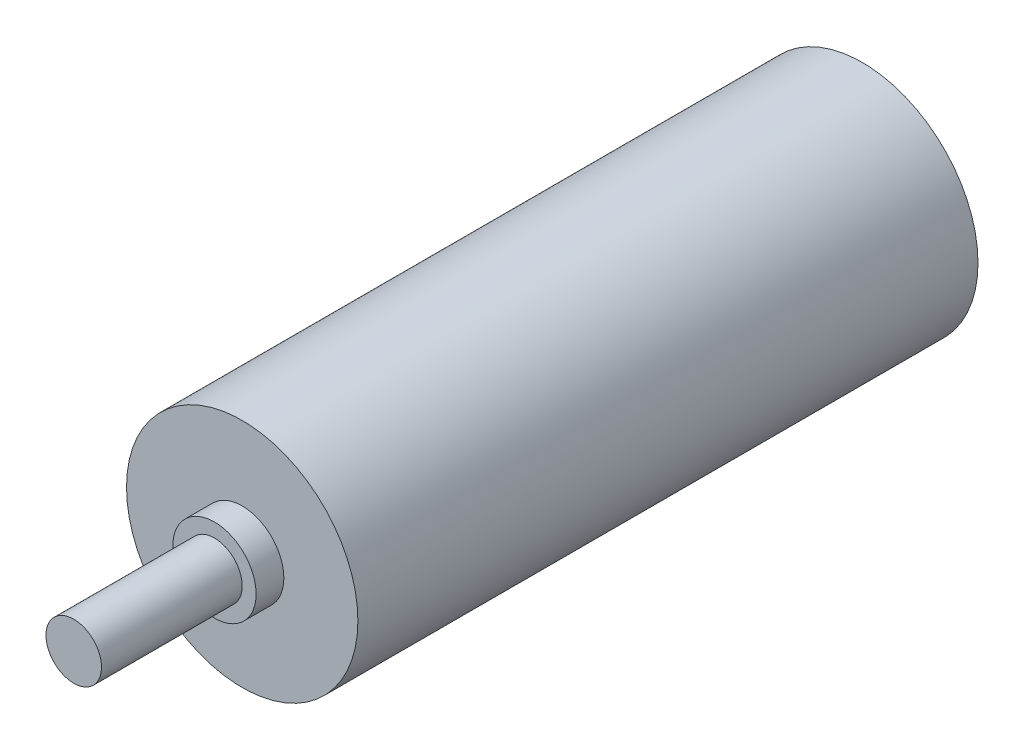
ISO-10303-21;
HEADER;
FILE_DESCRIPTION(('STEP AP214'),'2;1');
FILE_NAME('part.step','',(''),(''),'','','');
FILE_SCHEMA(('AUTOMOTIVE_DESIGN { 1 0 10303 214 1 1 1 1 }'));
ENDSEC;
DATA;
#1=APPLICATION_CONTEXT('core data for automotive mechanical design processes');
#2=APPLICATION_PROTOCOL_DEFINITION('international standard','automotive_design',2000,#1);
#3=PRODUCT_CONTEXT('',#1,'mechanical');
#4=PRODUCT('Part','Part','',(#3));
#5=PRODUCT_RELATED_PRODUCT_CATEGORY('part','',(#4));
#6=PRODUCT_DEFINITION_FORMATION('','',#4);
#7=PRODUCT_DEFINITION_CONTEXT('part definition',#1,'design');
#8=PRODUCT_DEFINITION('design','',#6,#7);
#9=PRODUCT_DEFINITION_SHAPE('','',#8);
#10=(LENGTH_UNIT() NAMED_UNIT(*) SI_UNIT(.MILLI.,.METRE.));
#11=(NAMED_UNIT(*) PLANE_ANGLE_UNIT() SI_UNIT($,.RADIAN.));
#12=(NAMED_UNIT(*) SI_UNIT($,.STERADIAN.) SOLID_ANGLE_UNIT());
#13=UNCERTAINTY_MEASURE_WITH_UNIT(LENGTH_MEASURE(1.E-05),#10,'distance_accuracy_value','');
#14=(GEOMETRIC_REPRESENTATION_CONTEXT(3) GLOBAL_UNCERTAINTY_ASSIGNED_CONTEXT((#13)) GLOBAL_UNIT_ASSIGNED_CONTEXT((#10,
#11,#12)) REPRESENTATION_CONTEXT('',''));
#15=CARTESIAN_POINT('',(0.,0.,0.));
#16=DIRECTION('',(0.,0.,1.));
#17=DIRECTION('',(1.,0.,0.));
#18=AXIS2_PLACEMENT_3D('',#15,#16,#17);
#19=CARTESIAN_POINT('',(0.,0.,67.));
#20=DIRECTION('',(0.,0.,-1.));
#21=DIRECTION('',(-1.,0.,0.));
#22=AXIS2_PLACEMENT_3D('',#19,#20,#21);
#23=CYLINDRICAL_SURFACE('',#22,12.5);
#24=CARTESIAN_POINT('',(0.,0.,67.));
#25=DIRECTION('',(0.,0.,1.));
#26=DIRECTION('',(1.,0.,0.));
#27=AXIS2_PLACEMENT_3D('',#24,#25,#26);
#28=CIRCLE('',#27,12.5);
#29=CARTESIAN_POINT('',(12.5,0.,67.));
#30=VERTEX_POINT('',#29);
#31=EDGE_CURVE('E44',#30,#30,#28,.T.);
#32=ORIENTED_EDGE('',*,*,#31,.F.);
#33=EDGE_LOOP('',(#32));
#34=FACE_BOUND('',#33,.T.);
#35=CARTESIAN_POINT('',(0.,0.,0.));
#36=DIRECTION('',(0.,0.,1.));
#37=DIRECTION('',(1.,0.,0.));
#38=AXIS2_PLACEMENT_3D('',#35,#36,#37);
#39=CIRCLE('',#38,12.5);
#40=CARTESIAN_POINT('',(12.5,0.,0.));
#41=VERTEX_POINT('',#40);
#42=EDGE_CURVE('E35',#41,#41,#39,.T.);
#43=ORIENTED_EDGE('',*,*,#42,.T.);
#44=EDGE_LOOP('',(#43));
#45=FACE_BOUND('',#44,.T.);
#46=ADVANCED_FACE('F32',(#34,#45),#23,.T.);
#47=CARTESIAN_POINT('',(0.,0.,67.));
#48=DIRECTION('',(0.,0.,1.));
#49=DIRECTION('',(1.,0.,0.));
#50=AXIS2_PLACEMENT_3D('',#47,#48,#49);
#51=PLANE('',#50);
#52=CARTESIAN_POINT('',(0.,0.,67.));
#53=DIRECTION('',(0.,0.,1.));
#54=DIRECTION('',(1.,0.,0.));
#55=AXIS2_PLACEMENT_3D('',#52,#53,#54);
#56=CIRCLE('',#55,4.5);
#57=CARTESIAN_POINT('',(4.5,0.,67.));
#58=VERTEX_POINT('',#57);
#59=EDGE_CURVE('E39',#58,#58,#56,.T.);
#60=ORIENTED_EDGE('',*,*,#59,.F.);
#61=EDGE_LOOP('',(#60));
#62=FACE_BOUND('',#61,.T.);
#63=ORIENTED_EDGE('',*,*,#31,.T.);
#64=EDGE_LOOP('',(#63));
#65=FACE_BOUND('',#64,.T.);
#66=ADVANCED_FACE('F61',(#62,#65),#51,.T.);
#67=CARTESIAN_POINT('',(0.,0.,0.));
#68=DIRECTION('',(0.,0.,1.));
#69=DIRECTION('',(1.,0.,0.));
#70=AXIS2_PLACEMENT_3D('',#67,#68,#69);
#71=PLANE('',#70);
#72=ORIENTED_EDGE('',*,*,#42,.F.);
#73=EDGE_LOOP('',(#72));
#74=FACE_BOUND('',#73,.T.);
#75=ADVANCED_FACE('F58',(#74),#71,.F.);
#76=CARTESIAN_POINT('',(0.,0.,70.));
#77=DIRECTION('',(0.,0.,-1.));
#78=DIRECTION('',(-1.,0.,0.));
#79=AXIS2_PLACEMENT_3D('',#76,#77,#78);
#80=CYLINDRICAL_SURFACE('',#79,4.5);
#81=CARTESIAN_POINT('',(0.,0.,70.));
#82=DIRECTION('',(0.,0.,1.));
#83=DIRECTION('',(1.,0.,0.));
#84=AXIS2_PLACEMENT_3D('',#81,#82,#83);
#85=CIRCLE('',#84,4.5);
#86=CARTESIAN_POINT('',(4.5,0.,70.));
#87=VERTEX_POINT('',#86);
#88=EDGE_CURVE('E49',#87,#87,#85,.T.);
#89=ORIENTED_EDGE('',*,*,#88,.F.);
#90=EDGE_LOOP('',(#89));
#91=FACE_BOUND('',#90,.T.);
#92=ORIENTED_EDGE('',*,*,#59,.T.);
#93=EDGE_LOOP('',(#92));
#94=FACE_BOUND('',#93,.T.);
#95=ADVANCED_FACE('F60',(#91,#94),#80,.T.);
#96=CARTESIAN_POINT('',(0.,0.,70.));
#97=DIRECTION('',(0.,0.,1.));
#98=DIRECTION('',(1.,0.,0.));
#99=AXIS2_PLACEMENT_3D('',#96,#97,#98);
#100=PLANE('',#99);
#101=CARTESIAN_POINT('',(0.,0.,70.));
#102=DIRECTION('',(0.,0.,1.));
#103=DIRECTION('',(1.,0.,0.));
#104=AXIS2_PLACEMENT_3D('',#101,#102,#103);
#105=CIRCLE('',#104,3.);
#106=CARTESIAN_POINT('',(-3.,0.,70.));
#107=VERTEX_POINT('',#106);
#108=EDGE_CURVE('E10',#107,#107,#105,.T.);
#109=ORIENTED_EDGE('',*,*,#108,.F.);
#110=EDGE_LOOP('',(#109));
#111=FACE_BOUND('',#110,.T.);
#112=ORIENTED_EDGE('',*,*,#88,.T.);
#113=EDGE_LOOP('',(#112));
#114=FACE_BOUND('',#113,.T.);
#115=ADVANCED_FACE('F66',(#111,#114),#100,.T.);
#116=CARTESIAN_POINT('',(0.,0.,85.2));
#117=DIRECTION('',(0.,0.,-1.));
#118=DIRECTION('',(-1.,0.,0.));
#119=AXIS2_PLACEMENT_3D('',#116,#117,#118);
#120=CYLINDRICAL_SURFACE('',#119,3.);
#121=CARTESIAN_POINT('',(0.,0.,85.2));
#122=DIRECTION('',(0.,0.,1.));
#123=DIRECTION('',(1.,0.,0.));
#124=AXIS2_PLACEMENT_3D('',#121,#122,#123);
#125=CIRCLE('',#124,3.);
#126=CARTESIAN_POINT('',(-3.,0.,85.2));
#127=VERTEX_POINT('',#126);
#128=EDGE_CURVE('E48',#127,#127,#125,.T.);
#129=CARTESIAN_POINT('',(-3.,0.,85.2));
#130=CARTESIAN_POINT('',(-3.,0.,85.0416666666667));
#131=CARTESIAN_POINT('',(-3.,0.,84.8833333333333));
#132=CARTESIAN_POINT('',(-3.,0.,84.5666666666667));
#133=CARTESIAN_POINT('',(-3.,0.,84.4083333333333));
#134=CARTESIAN_POINT('',(-3.,0.,84.0916666666667));
#135=CARTESIAN_POINT('',(-3.,0.,83.9333333333333));
#136=CARTESIAN_POINT('',(-3.,0.,83.6166666666667));
#137=CARTESIAN_POINT('',(-3.,0.,83.4583333333333));
#138=CARTESIAN_POINT('',(-3.,0.,83.1416666666667));
#139=CARTESIAN_POINT('',(-3.,0.,82.9833333333333));
#140=CARTESIAN_POINT('',(-3.,0.,82.6666666666667));
#141=CARTESIAN_POINT('',(-3.,0.,82.5083333333333));
#142=CARTESIAN_POINT('',(-3.,0.,82.1916666666667));
#143=CARTESIAN_POINT('',(-3.,0.,82.0333333333333));
#144=CARTESIAN_POINT('',(-3.,0.,81.7166666666667));
#145=CARTESIAN_POINT('',(-3.,0.,81.5583333333333));
#146=CARTESIAN_POINT('',(-3.,0.,81.2416666666667));
#147=CARTESIAN_POINT('',(-3.,0.,81.0833333333333));
#148=CARTESIAN_POINT('',(-3.,0.,80.7666666666667));
#149=CARTESIAN_POINT('',(-3.,0.,80.6083333333333));
#150=CARTESIAN_POINT('',(-3.,0.,80.2916666666667));
#151=CARTESIAN_POINT('',(-3.,0.,80.1333333333333));
#152=CARTESIAN_POINT('',(-3.,0.,79.8166666666667));
#153=CARTESIAN_POINT('',(-3.,0.,79.6583333333333));
#154=CARTESIAN_POINT('',(-3.,0.,79.3416666666667));
#155=CARTESIAN_POINT('',(-3.,0.,79.1833333333333));
#156=CARTESIAN_POINT('',(-3.,0.,78.8666666666667));
#157=CARTESIAN_POINT('',(-3.,0.,78.7083333333333));
#158=CARTESIAN_POINT('',(-3.,0.,78.3916666666667));
#159=CARTESIAN_POINT('',(-3.,0.,78.2333333333333));
#160=CARTESIAN_POINT('',(-3.,0.,77.9166666666667));
#161=CARTESIAN_POINT('',(-3.,0.,77.7583333333333));
#162=CARTESIAN_POINT('',(-3.,0.,77.4416666666667));
#163=CARTESIAN_POINT('',(-3.,0.,77.2833333333333));
#164=CARTESIAN_POINT('',(-3.,0.,76.9666666666667));
#165=CARTESIAN_POINT('',(-3.,0.,76.8083333333333));
#166=CARTESIAN_POINT('',(-3.,0.,76.4916666666667));
#167=CARTESIAN_POINT('',(-3.,0.,76.3333333333333));
#168=CARTESIAN_POINT('',(-3.,0.,76.0166666666667));
#169=CARTESIAN_POINT('',(-3.,0.,75.8583333333333));
#170=CARTESIAN_POINT('',(-3.,0.,75.5416666666667));
#171=CARTESIAN_POINT('',(-3.,0.,75.3833333333333));
#172=CARTESIAN_POINT('',(-3.,0.,75.0666666666667));
#173=CARTESIAN_POINT('',(-3.,0.,74.9083333333333));
#174=CARTESIAN_POINT('',(-3.,0.,74.5916666666667));
#175=CARTESIAN_POINT('',(-3.,0.,74.4333333333333));
#176=CARTESIAN_POINT('',(-3.,0.,74.1166666666667));
#177=CARTESIAN_POINT('',(-3.,0.,73.9583333333333));
#178=CARTESIAN_POINT('',(-3.,0.,73.6416666666667));
#179=CARTESIAN_POINT('',(-3.,0.,73.4833333333333));
#180=CARTESIAN_POINT('',(-3.,0.,73.1666666666667));
#181=CARTESIAN_POINT('',(-3.,0.,73.0083333333333));
#182=CARTESIAN_POINT('',(-3.,0.,72.6916666666667));
#183=CARTESIAN_POINT('',(-3.,0.,72.5333333333333));
#184=CARTESIAN_POINT('',(-3.,0.,72.2166666666667));
#185=CARTESIAN_POINT('',(-3.,0.,72.0583333333333));
#186=CARTESIAN_POINT('',(-3.,0.,71.7416666666667));
#187=CARTESIAN_POINT('',(-3.,0.,71.5833333333333));
#188=CARTESIAN_POINT('',(-3.,0.,71.2666666666667));
#189=CARTESIAN_POINT('',(-3.,0.,71.1083333333333));
#190=CARTESIAN_POINT('',(-3.,0.,70.7916666666667));
#191=CARTESIAN_POINT('',(-3.,0.,70.6333333333333));
#192=CARTESIAN_POINT('',(-3.,0.,70.3166666666667));
#193=CARTESIAN_POINT('',(-3.,0.,70.1583333333333));
#194=CARTESIAN_POINT('',(-3.,0.,70.));
#195=B_SPLINE_CURVE_WITH_KNOTS('',3,(#129,#130,#131,#132,#133,#134,#135,#136,#137,#138,#139,
#140,#141,#142,#143,#144,#145,#146,#147,#148,#149,#150,#151,#152,#153,#154,#155,#156,#157,#158,
#159,#160,#161,#162,#163,#164,#165,#166,#167,#168,#169,#170,#171,#172,#173,#174,#175,#176,#177,
#178,#179,#180,#181,#182,#183,#184,#185,#186,#187,#188,#189,#190,#191,#192,#193,#194),
.UNSPECIFIED.,.F.,.F.,(4,2,2,2,2,2,2,2,2,2,2,2,2,2,2,2,2,2,2,2,2,2,2,2,2,2,2,2,2,2,2,2,4),(0.,
0.475000000000003,0.950000000000006,1.42500000000001,1.90000000000001,2.375,2.85000000000001,
3.32500000000001,3.80000000000001,4.27500000000001,4.75,5.22500000000001,5.70000000000001,
6.17500000000001,6.65,7.12500000000001,7.60000000000001,8.07500000000001,8.55000000000002,
9.02500000000001,9.50000000000001,9.97500000000001,10.45,10.925,11.4,11.875,12.35,12.825,13.3,
13.775,14.25,14.725,15.2),.UNSPECIFIED.);
#196=EDGE_CURVE('BSEAM96',#127,#107,#195,.T.);
#197=ORIENTED_EDGE('',*,*,#128,.F.);
#198=ORIENTED_EDGE('',*,*,#108,.T.);
#199=ORIENTED_EDGE('',*,*,#196,.T.);
#200=ORIENTED_EDGE('',*,*,#196,.F.);
#201=EDGE_LOOP('',(#197,#199,#198,#200));
#202=FACE_BOUND('',#201,.T.);
#203=ADVANCED_FACE('F96',(#202),#120,.T.);
#204=CARTESIAN_POINT('',(0.,0.,85.2));
#205=DIRECTION('',(0.,0.,1.));
#206=DIRECTION('',(1.,0.,0.));
#207=AXIS2_PLACEMENT_3D('',#204,#205,#206);
#208=PLANE('',#207);
#209=ORIENTED_EDGE('',*,*,#128,.T.);
#210=EDGE_LOOP('',(#209));
#211=FACE_BOUND('',#210,.T.);
#212=ADVANCED_FACE('F106',(#211),#208,.T.);
#213=CLOSED_SHELL('',(#46,#66,#75,#95,#115,#203,#212));
#214=MANIFOLD_SOLID_BREP('B2',#213);
#215=ADVANCED_BREP_SHAPE_REPRESENTATION('',(#18,#214),#14);
#216=SHAPE_DEFINITION_REPRESENTATION(#9,#215);
ENDSEC;
END-ISO-10303-21;
